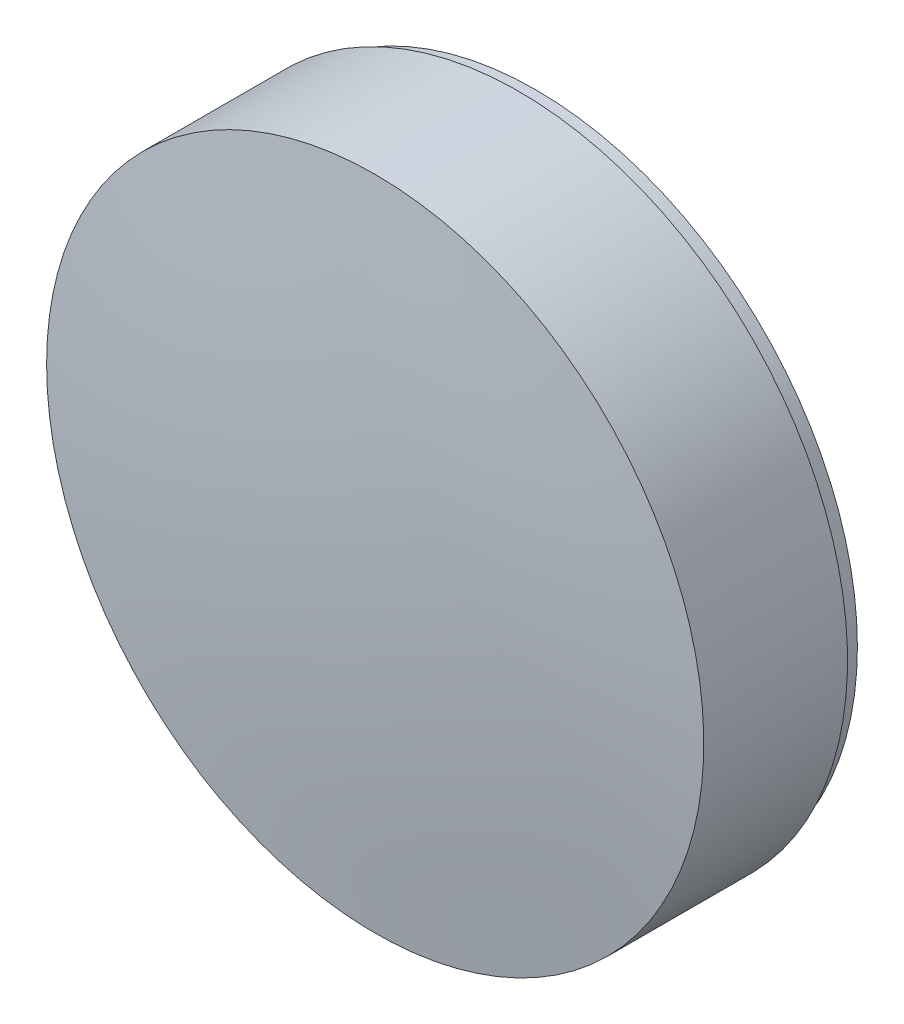
ISO-10303-21;
HEADER;
FILE_DESCRIPTION(('STEP AP214'),'2;1');
FILE_NAME('part.step','',(''),(''),'','','');
FILE_SCHEMA(('AUTOMOTIVE_DESIGN { 1 0 10303 214 1 1 1 1 }'));
ENDSEC;
DATA;
#1=APPLICATION_CONTEXT('core data for automotive mechanical design processes');
#2=APPLICATION_PROTOCOL_DEFINITION('international standard','automotive_design',2000,#1);
#3=PRODUCT_CONTEXT('',#1,'mechanical');
#4=PRODUCT('Part','Part','',(#3));
#5=PRODUCT_RELATED_PRODUCT_CATEGORY('part','',(#4));
#6=PRODUCT_DEFINITION_FORMATION('','',#4);
#7=PRODUCT_DEFINITION_CONTEXT('part definition',#1,'design');
#8=PRODUCT_DEFINITION('design','',#6,#7);
#9=PRODUCT_DEFINITION_SHAPE('','',#8);
#10=(LENGTH_UNIT() NAMED_UNIT(*) SI_UNIT(.MILLI.,.METRE.));
#11=(NAMED_UNIT(*) PLANE_ANGLE_UNIT() SI_UNIT($,.RADIAN.));
#12=(NAMED_UNIT(*) SI_UNIT($,.STERADIAN.) SOLID_ANGLE_UNIT());
#13=UNCERTAINTY_MEASURE_WITH_UNIT(LENGTH_MEASURE(1.E-05),#10,'distance_accuracy_value','');
#14=(GEOMETRIC_REPRESENTATION_CONTEXT(3) GLOBAL_UNCERTAINTY_ASSIGNED_CONTEXT((#13)) GLOBAL_UNIT_ASSIGNED_CONTEXT((#10,
#11,#12)) REPRESENTATION_CONTEXT('',''));
#15=CARTESIAN_POINT('',(0.,0.,0.));
#16=DIRECTION('',(0.,0.,1.));
#17=DIRECTION('',(1.,0.,0.));
#18=AXIS2_PLACEMENT_3D('',#15,#16,#17);
#19=CARTESIAN_POINT('',(0.,2.22044604925031E-13,25.9272829420325));
#20=DIRECTION('',(0.,0.,-1.));
#21=DIRECTION('',(0.,-1.,0.));
#22=AXIS2_PLACEMENT_3D('',#19,#20,#21);
#23=SPHERICAL_SURFACE('',#22,28.9172829420327);
#24=CARTESIAN_POINT('',(0.,2.22044604925031E-13,-2.62979591329822));
#25=DIRECTION('',(0.,0.,-1.));
#26=DIRECTION('',(-1.,0.,0.));
#27=AXIS2_PLACEMENT_3D('',#24,#25,#26);
#28=CIRCLE('',#27,4.55);
#29=CARTESIAN_POINT('',(-4.55,2.22044604925031E-13,-2.62979591329822));
#30=VERTEX_POINT('',#29);
#31=EDGE_CURVE('E11',#30,#30,#28,.T.);
#32=ORIENTED_EDGE('',*,*,#31,.T.);
#33=EDGE_LOOP('',(#32));
#34=FACE_BOUND('',#33,.T.);
#35=ADVANCED_FACE('F33',(#34),#23,.T.);
#36=CARTESIAN_POINT('',(0.,2.22044604925031E-13,-3.36455163711769));
#37=DIRECTION('',(0.,0.,-1.));
#38=DIRECTION('',(-1.,0.,0.));
#39=AXIS2_PLACEMENT_3D('',#36,#37,#38);
#40=CYLINDRICAL_SURFACE('',#39,4.54999999999989);
#41=CARTESIAN_POINT('',(0.,2.22044604925031E-13,-2.39000000000022));
#42=DIRECTION('',(0.,0.,-1.));
#43=DIRECTION('',(-1.,0.,0.));
#44=AXIS2_PLACEMENT_3D('',#41,#42,#43);
#45=CIRCLE('',#44,4.54999999999978);
#46=CARTESIAN_POINT('',(-4.54999999999978,2.22044604925031E-13,-2.39000000000022));
#47=VERTEX_POINT('',#46);
#48=EDGE_CURVE('E39',#47,#47,#45,.T.);
#49=ORIENTED_EDGE('',*,*,#48,.T.);
#50=EDGE_LOOP('',(#49));
#51=FACE_BOUND('',#50,.T.);
#52=ORIENTED_EDGE('',*,*,#31,.F.);
#53=EDGE_LOOP('',(#52));
#54=FACE_BOUND('',#53,.T.);
#55=ADVANCED_FACE('F62',(#51,#54),#40,.T.);
#56=CARTESIAN_POINT('',(0.,4.65,-2.39000000000022));
#57=DIRECTION('',(0.,0.,-1.));
#58=DIRECTION('',(-1.,0.,0.));
#59=AXIS2_PLACEMENT_3D('',#56,#57,#58);
#60=PLANE('',#59);
#61=CARTESIAN_POINT('',(0.,2.22044604925031E-13,-2.39000000000022));
#62=DIRECTION('',(0.,0.,-1.));
#63=DIRECTION('',(-1.,0.,0.));
#64=AXIS2_PLACEMENT_3D('',#61,#62,#63);
#65=CIRCLE('',#64,4.64999999999978);
#66=CARTESIAN_POINT('',(-4.64999999999978,2.22044604925031E-13,-2.39000000000022));
#67=VERTEX_POINT('',#66);
#68=EDGE_CURVE('E51',#67,#67,#65,.T.);
#69=ORIENTED_EDGE('',*,*,#68,.T.);
#70=EDGE_LOOP('',(#69));
#71=FACE_BOUND('',#70,.T.);
#72=ORIENTED_EDGE('',*,*,#48,.F.);
#73=EDGE_LOOP('',(#72));
#74=FACE_BOUND('',#73,.T.);
#75=ADVANCED_FACE('F65',(#71,#74),#60,.T.);
#76=CARTESIAN_POINT('',(0.,2.22044604925031E-13,-3.36455163711769));
#77=DIRECTION('',(0.,0.,-1.));
#78=DIRECTION('',(-1.,0.,0.));
#79=AXIS2_PLACEMENT_3D('',#76,#77,#78);
#80=CYLINDRICAL_SURFACE('',#79,4.64999999999978);
#81=CARTESIAN_POINT('',(0.,2.22044604925031E-13,-0.35637));
#82=DIRECTION('',(0.,0.,-1.));
#83=DIRECTION('',(-1.,0.,0.));
#84=AXIS2_PLACEMENT_3D('',#81,#82,#83);
#85=CIRCLE('',#84,4.64999999999978);
#86=CARTESIAN_POINT('',(-4.64999999999978,2.22044604925031E-13,-0.35637));
#87=VERTEX_POINT('',#86);
#88=EDGE_CURVE('E49',#87,#87,#85,.T.);
#89=ORIENTED_EDGE('',*,*,#88,.T.);
#90=EDGE_LOOP('',(#89));
#91=FACE_BOUND('',#90,.T.);
#92=ORIENTED_EDGE('',*,*,#68,.F.);
#93=EDGE_LOOP('',(#92));
#94=FACE_BOUND('',#93,.T.);
#95=ADVANCED_FACE('F45',(#91,#94),#80,.T.);
#96=CARTESIAN_POINT('',(0.,4.65,-0.35637));
#97=CARTESIAN_POINT('',(0.,4.63333308399777,-0.354412117270665));
#98=CARTESIAN_POINT('',(0.,4.59999808909934,-0.350496215205438));
#99=CARTESIAN_POINT('',(0.,4.54999872527502,-0.344584087784677));
#100=CARTESIAN_POINT('',(0.,4.50000039812673,-0.338646650478964));
#101=CARTESIAN_POINT('',(0.,4.44999773132786,-0.332729079103867));
#102=CARTESIAN_POINT('',(0.,4.40000046959216,-0.326756057247614));
#103=CARTESIAN_POINT('',(0.,4.34999843310686,-0.320806458461914));
#104=CARTESIAN_POINT('',(0.,4.30000030429141,-0.314817453036069));
#105=CARTESIAN_POINT('',(0.,4.24999917157731,-0.308843588391519));
#106=CARTESIAN_POINT('',(0.,4.20000025585113,-0.302847863809606));
#107=CARTESIAN_POINT('',(0.,4.14999901765063,-0.29686486205368));
#108=CARTESIAN_POINT('',(0.,4.10000170287125,-0.290852451816914));
#109=CARTESIAN_POINT('',(0.,4.04999889506818,-0.284885896588384));
#110=CARTESIAN_POINT('',(0.,4.00000153676256,-0.27888382058828));
#111=CARTESIAN_POINT('',(0.,3.95000045920082,-0.272919479079704));
#112=CARTESIAN_POINT('',(0.,3.90000054861486,-0.266958730825484));
#113=CARTESIAN_POINT('',(0.,3.85000125950477,-0.261006063782549));
#114=CARTESIAN_POINT('',(0.,3.80000105005909,-0.255077802454119));
#115=CARTESIAN_POINT('',(0.,3.75000193297275,-0.249163601832983));
#116=CARTESIAN_POINT('',(0.,3.70000090836219,-0.243288932593061));
#117=CARTESIAN_POINT('',(0.,3.65000253691539,-0.2374216192666));
#118=CARTESIAN_POINT('',(0.,3.60000161611688,-0.231606070624982));
#119=CARTESIAN_POINT('',(0.,3.55000169377807,-0.225815339631181));
#120=CARTESIAN_POINT('',(0.,3.50000224359153,-0.220053799314847));
#121=CARTESIAN_POINT('',(0.,3.45000292082981,-0.214331023444599));
#122=CARTESIAN_POINT('',(0.,3.40000218966828,-0.208663942573478));
#123=CARTESIAN_POINT('',(0.,3.35000208571271,-0.203034761353167));
#124=CARTESIAN_POINT('',(0.,3.30000349362529,-0.197438586286022));
#125=CARTESIAN_POINT('',(0.,3.25000260798603,-0.191912969513494));
#126=CARTESIAN_POINT('',(0.,3.2000027594701,-0.186431372379729));
#127=CARTESIAN_POINT('',(0.,3.15000252663223,-0.18100330534826));
#128=CARTESIAN_POINT('',(0.,3.10000386292194,-0.175617215058917));
#129=CARTESIAN_POINT('',(0.,3.0500031541925,-0.170310093929623));
#130=CARTESIAN_POINT('',(0.,3.00000233050246,-0.165064394654203));
#131=CARTESIAN_POINT('',(0.,2.9500043952649,-0.159854091333644));
#132=CARTESIAN_POINT('',(0.,2.90000288730268,-0.15474159321734));
#133=CARTESIAN_POINT('',(0.,2.85000287643387,-0.149681450732556));
#134=CARTESIAN_POINT('',(0.,2.80000418430282,-0.144674473758727));
#135=CARTESIAN_POINT('',(0.,2.75000265258224,-0.139762862773478));
#136=CARTESIAN_POINT('',(0.,2.70000393423748,-0.134895906589614));
#137=CARTESIAN_POINT('',(0.,2.65000388216943,-0.130115658996368));
#138=CARTESIAN_POINT('',(0.,2.60000247455054,-0.125423536004841));
#139=CARTESIAN_POINT('',(0.,2.55000442183412,-0.120771897671983));
#140=CARTESIAN_POINT('',(0.,2.5000029172022,-0.116230994605177));
#141=CARTESIAN_POINT('',(0.,2.45000362258364,-0.111745903420964));
#142=CARTESIAN_POINT('',(0.,2.40000343641733,-0.107347243256065));
#143=CARTESIAN_POINT('',(0.,2.35000340180705,-0.103026934550185));
#144=CARTESIAN_POINT('',(0.,2.30000335088086,-0.0987867644767161));
#145=CARTESIAN_POINT('',(0.,2.25000321340306,-0.0946276890291587));
#146=CARTESIAN_POINT('',(0.,2.20000370267677,-0.0905441201521595));
#147=CARTESIAN_POINT('',(0.,2.15000308935407,-0.0865575343343146));
#148=CARTESIAN_POINT('',(0.,2.10000305224708,-0.0826472520459109));
#149=CARTESIAN_POINT('',(0.,2.05000341521512,-0.0788149062789955));
#150=CARTESIAN_POINT('',(0.,2.00000334991687,-0.0750746419949595));
#151=CARTESIAN_POINT('',(0.,1.95000279331576,-0.0714279744962081));
#152=CARTESIAN_POINT('',(0.,1.90000319377213,-0.0678547392379237));
#153=CARTESIAN_POINT('',(0.,1.85000312997436,-0.0643743873356622));
#154=CARTESIAN_POINT('',(0.,1.80000252886584,-0.060988964211047));
#155=CARTESIAN_POINT('',(0.,1.75000342073279,-0.0576708729661524));
#156=CARTESIAN_POINT('',(0.,1.70000239971596,-0.0544687575406953));
#157=CARTESIAN_POINT('',(0.,1.6500027758851,-0.0513350978492079));
#158=CARTESIAN_POINT('',(0.,1.60000307462516,-0.0482918747915191));
#159=CARTESIAN_POINT('',(0.,1.55000221474647,-0.0453584366230861));
#160=CARTESIAN_POINT('',(0.,1.50000252671099,-0.0424952171387429));
#161=CARTESIAN_POINT('',(0.,1.4500028134274,-0.0397215477319262));
#162=CARTESIAN_POINT('',(0.,1.40000195797373,-0.037059447748668));
#163=CARTESIAN_POINT('',(0.,1.35000264322153,-0.0344613603502855));
#164=CARTESIAN_POINT('',(0.,1.30000215422176,-0.031975857307435));
#165=CARTESIAN_POINT('',(0.,1.2500020832947,-0.029575862546152));
#166=CARTESIAN_POINT('',(0.,1.20000234876681,-0.027261297643246));
#167=CARTESIAN_POINT('',(0.,1.15000161186543,-0.025059538362041));
#168=CARTESIAN_POINT('',(0.,1.10000217774885,-0.0229210252834684));
#169=CARTESIAN_POINT('',(0.,1.05000171129882,-0.0208968614084128));
#170=CARTESIAN_POINT('',(0.,1.00000194342306,-0.0189519644432664));
#171=CARTESIAN_POINT('',(0.,0.95000158716201,-0.0171156995969594));
#172=CARTESIAN_POINT('',(0.,0.900001517266116,-0.0153655891704349));
#173=CARTESIAN_POINT('',(0.,0.850001644278538,-0.0137022611912161));
#174=CARTESIAN_POINT('',(0.,0.800001341152238,-0.0121456700017162));
#175=CARTESIAN_POINT('',(0.,0.750001274822285,-0.0106753097325884));
#176=CARTESIAN_POINT('',(0.,0.700001333900803,-0.00929331283931456));
#177=CARTESIAN_POINT('',(0.,0.65000126565486,-0.0080116487369474));
#178=CARTESIAN_POINT('',(0.,0.600000833752981,-0.00684026988055319));
#179=CARTESIAN_POINT('',(0.,0.550001238621518,-0.00572740515561463));
#180=CARTESIAN_POINT('',(0.,0.500000687918572,-0.00475024498727406));
#181=CARTESIAN_POINT('',(0.,0.450000894265694,-0.00383170760446181));
#182=CARTESIAN_POINT('',(0.,0.400000760190021,-0.00302301139123352));
#183=CARTESIAN_POINT('',(0.,0.350000582921692,-0.0023163154726698));
#184=CARTESIAN_POINT('',(0.,0.300000587131548,-0.00169177579824464));
#185=CARTESIAN_POINT('',(0.,0.250000412111092,-0.00117661956530481));
#186=CARTESIAN_POINT('',(0.,0.200000392515434,-0.000741771009158405));
#187=CARTESIAN_POINT('',(0.,0.15000024702728,-0.000416313471446205));
#188=CARTESIAN_POINT('',(0.,0.100000196321359,-0.000172984178511816));
#189=CARTESIAN_POINT('',(0.,0.0500000823356149,-3.17542173669784E-05));
#190=CARTESIAN_POINT('',(0.,0.0166666751119135,-1.058472705577E-05));
#191=CARTESIAN_POINT('',(0.,0.,0.));
#192=B_SPLINE_CURVE_WITH_KNOTS('',3,(#96,#97,#98,#99,#100,#101,#102,#103,#104,#105,#106,#107,
#108,#109,#110,#111,#112,#113,#114,#115,#116,#117,#118,#119,#120,#121,#122,#123,#124,#125,#126,
#127,#128,#129,#130,#131,#132,#133,#134,#135,#136,#137,#138,#139,#140,#141,#142,#143,#144,#145,
#146,#147,#148,#149,#150,#151,#152,#153,#154,#155,#156,#157,#158,#159,#160,#161,#162,#163,#164,
#165,#166,#167,#168,#169,#170,#171,#172,#173,#174,#175,#176,#177,#178,#179,#180,#181,#182,#183,
#184,#185,#186,#187,#188,#189,#190,#191),.UNSPECIFIED.,.F.,.F.,(4,1,1,1,1,1,1,1,1,1,1,1,1,1,1,1,
1,1,1,1,1,1,1,1,1,1,1,1,1,1,1,1,1,1,1,1,1,1,1,1,1,1,1,1,1,1,1,1,1,1,1,1,1,1,1,1,1,1,1,1,1,1,1,1,
1,1,1,1,1,1,1,1,1,1,1,1,1,1,1,1,1,1,1,1,1,1,1,1,1,1,1,1,1,4),(0.,0.0107873166761865,
0.0215753860114396,0.032363959218018,0.0431525324245963,0.0539418645854951,0.0647311967463939,
0.0755210369747172,0.0863108772030405,0.0971009720943505,0.107891066985661,0.118681416959434,
0.129471257187758,0.140261352079068,0.15105093806391,0.161840270224809,0.17262934898133,
0.183417922187908,0.194205991523161,0.204993308199347,0.215780125201778,0.226565947895241,
0.237351029266617,0.248135373096464,0.258918739419812,0.269700893316153,0.280482084837993,
0.2912623207136,0.302041135739271,0.312818778294935,0.323595258903898,0.334370588092871,
0.345144322985152,0.35591670777129,0.36668797906133,0.377457490686301,0.388225700280977,
0.398992623038776,0.409757853657684,0.420521832912104,0.43128416734353,0.442044884006735,
0.452804405105818,0.463562161417014,0.474318568817715,0.485073460012676,0.495826862112881,
0.506578802240577,0.517329307529079,0.528078405122565,0.538825951518207,0.549572147935378,
0.56031702155092,0.571060439511944,0.581802436240829,0.592543198561111,0.603282604706326,
0.614020689137446,0.624757627652085,0.635493172088506,0.646227631926609,0.656960904183499,
0.667692897392713,0.678423898058561,0.689153814736508,0.699882567508415,0.710610419878148,
0.721337185159772,0.732063008565951,0.742787924688741,0.753511873300475,0.764235078667443,
0.774957393442885,0.785678943235346,0.796399683666493,0.807119732237982,0.817839123597804,
0.828557825366711,0.83927594309023,0.849993511435079,0.860710510024153,0.871426981669271,
0.882143062587996,0.892858651008366,0.903573913797559,0.914288808097433,0.925003376745033,
0.935717688934503,0.946431756872427,0.957145641618037,0.967859363523404,0.978572975510209,
0.989286506075129,1.),.UNSPECIFIED.);
#193=CARTESIAN_POINT('',(0.,2.22044604925031E-13,-3.36455163711769));
#194=DIRECTION('',(0.,0.,-1.));
#195=AXIS1_PLACEMENT('',#193,#194);
#196=SURFACE_OF_REVOLUTION('',#192,#195);
#197=CARTESIAN_POINT('',(0.,0.,0.));
#198=VERTEX_POINT('',#197);
#199=VERTEX_LOOP('',#198);
#200=FACE_BOUND('',#199,.T.);
#201=ORIENTED_EDGE('',*,*,#88,.F.);
#202=EDGE_LOOP('',(#201));
#203=FACE_BOUND('',#202,.T.);
#204=ADVANCED_FACE('F42',(#200,#203),#196,.F.);
#205=CLOSED_SHELL('',(#35,#55,#75,#95,#204));
#206=MANIFOLD_SOLID_BREP('B2',#205);
#207=ADVANCED_BREP_SHAPE_REPRESENTATION('',(#18,#206),#14);
#208=SHAPE_DEFINITION_REPRESENTATION(#9,#207);
ENDSEC;
END-ISO-10303-21;
